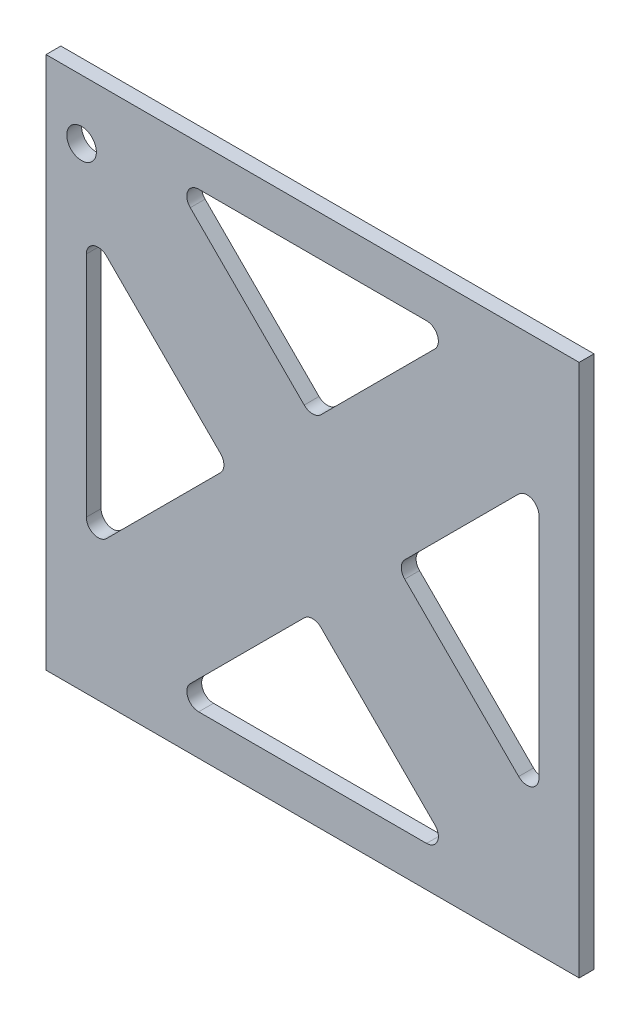
ISO-10303-21;
HEADER;
FILE_DESCRIPTION(('STEP AP214'),'2;1');
FILE_NAME('part.step','',(''),(''),'','','');
FILE_SCHEMA(('AUTOMOTIVE_DESIGN { 1 0 10303 214 1 1 1 1 }'));
ENDSEC;
DATA;
#1=APPLICATION_CONTEXT('core data for automotive mechanical design processes');
#2=APPLICATION_PROTOCOL_DEFINITION('international standard','automotive_design',2000,#1);
#3=PRODUCT_CONTEXT('',#1,'mechanical');
#4=PRODUCT('Part','Part','',(#3));
#5=PRODUCT_RELATED_PRODUCT_CATEGORY('part','',(#4));
#6=PRODUCT_DEFINITION_FORMATION('','',#4);
#7=PRODUCT_DEFINITION_CONTEXT('part definition',#1,'design');
#8=PRODUCT_DEFINITION('design','',#6,#7);
#9=PRODUCT_DEFINITION_SHAPE('','',#8);
#10=(LENGTH_UNIT() NAMED_UNIT(*) SI_UNIT(.MILLI.,.METRE.));
#11=(NAMED_UNIT(*) PLANE_ANGLE_UNIT() SI_UNIT($,.RADIAN.));
#12=(NAMED_UNIT(*) SI_UNIT($,.STERADIAN.) SOLID_ANGLE_UNIT());
#13=UNCERTAINTY_MEASURE_WITH_UNIT(LENGTH_MEASURE(1.E-05),#10,'distance_accuracy_value','');
#14=(GEOMETRIC_REPRESENTATION_CONTEXT(3) GLOBAL_UNCERTAINTY_ASSIGNED_CONTEXT((#13)) GLOBAL_UNIT_ASSIGNED_CONTEXT((#10,
#11,#12)) REPRESENTATION_CONTEXT('',''));
#15=CARTESIAN_POINT('',(0.,0.,0.));
#16=DIRECTION('',(0.,0.,1.));
#17=DIRECTION('',(1.,0.,0.));
#18=AXIS2_PLACEMENT_3D('',#15,#16,#17);
#19=CARTESIAN_POINT('',(0.,0.,1.5875));
#20=DIRECTION('',(0.,0.,-1.));
#21=DIRECTION('',(-1.,0.,0.));
#22=AXIS2_PLACEMENT_3D('',#19,#20,#21);
#23=PLANE('',#22);
#24=CARTESIAN_POINT('',(24.4251878529386,-45.9778025435045,1.5875));
#25=DIRECTION('',(0.,0.,1.));
#26=DIRECTION('',(1.,0.,0.));
#27=AXIS2_PLACEMENT_3D('',#24,#25,#26);
#28=CIRCLE('',#27,2.54);
#29=CARTESIAN_POINT('',(24.4251878529385,-48.5178025435045,1.5875));
#30=VERTEX_POINT('',#29);
#31=CARTESIAN_POINT('',(26.2212390771524,-44.1817513192906,1.5875));
#32=VERTEX_POINT('',#31);
#33=EDGE_CURVE('E274',#30,#32,#28,.T.);
#34=ORIENTED_EDGE('',*,*,#33,.F.);
#35=DIRECTION('',(1.,0.,0.));
#36=VECTOR('',#35,1.);
#37=CARTESIAN_POINT('',(-24.4251878529385,-48.5178025435045,1.5875));
#38=LINE('',#37,#36);
#39=CARTESIAN_POINT('',(-24.4251878529385,-48.5178025435045,1.5875));
#40=VERTEX_POINT('',#39);
#41=EDGE_CURVE('E286',#40,#30,#38,.T.);
#42=ORIENTED_EDGE('',*,*,#41,.F.);
#43=CARTESIAN_POINT('',(-24.4251878529386,-45.9778025435045,1.5875));
#44=DIRECTION('',(0.,0.,1.));
#45=DIRECTION('',(1.,0.,0.));
#46=AXIS2_PLACEMENT_3D('',#43,#44,#45);
#47=CIRCLE('',#46,2.54000000000002);
#48=CARTESIAN_POINT('',(-26.2212390771524,-44.1817513192907,1.5875));
#49=VERTEX_POINT('',#48);
#50=EDGE_CURVE('E283',#49,#40,#47,.T.);
#51=ORIENTED_EDGE('',*,*,#50,.F.);
#52=DIRECTION('',(-0.707106781186548,-0.707106781186547,0.));
#53=VECTOR('',#52,1.);
#54=CARTESIAN_POINT('',(-1.7960512242138,-19.7565634663521,1.5875));
#55=LINE('',#54,#53);
#56=CARTESIAN_POINT('',(-1.7960512242138,-19.7565634663521,1.5875));
#57=VERTEX_POINT('',#56);
#58=EDGE_CURVE('E281',#57,#49,#55,.T.);
#59=ORIENTED_EDGE('',*,*,#58,.F.);
#60=CARTESIAN_POINT('',(0.,-21.552614690566,1.5875));
#61=DIRECTION('',(0.,0.,1.));
#62=DIRECTION('',(-1.,0.,0.));
#63=AXIS2_PLACEMENT_3D('',#60,#61,#62);
#64=CIRCLE('',#63,2.54000000000003);
#65=CARTESIAN_POINT('',(1.79605122421386,-19.7565634663521,1.5875));
#66=VERTEX_POINT('',#65);
#67=EDGE_CURVE('E279',#66,#57,#64,.T.);
#68=ORIENTED_EDGE('',*,*,#67,.F.);
#69=DIRECTION('',(-0.707106781186547,0.707106781186548,0.));
#70=VECTOR('',#69,1.);
#71=CARTESIAN_POINT('',(1.79605122421386,-19.7565634663521,1.5875));
#72=LINE('',#71,#70);
#73=EDGE_CURVE('E276',#32,#66,#72,.T.);
#74=ORIENTED_EDGE('',*,*,#73,.F.);
#75=EDGE_LOOP('',(#34,#42,#51,#59,#68,#74));
#76=FACE_BOUND('',#75,.T.);
#77=CARTESIAN_POINT('',(-45.9778025435045,-24.4251878529386,1.5875));
#78=DIRECTION('',(0.,0.,1.));
#79=DIRECTION('',(1.,0.,0.));
#80=AXIS2_PLACEMENT_3D('',#77,#78,#79);
#81=CIRCLE('',#80,2.54000000000004);
#82=CARTESIAN_POINT('',(-48.5178025435045,-24.4251878529386,1.5875));
#83=VERTEX_POINT('',#82);
#84=CARTESIAN_POINT('',(-44.1817513192906,-26.2212390771524,1.5875));
#85=VERTEX_POINT('',#84);
#86=EDGE_CURVE('E364',#83,#85,#81,.T.);
#87=ORIENTED_EDGE('',*,*,#86,.F.);
#88=DIRECTION('',(0.,-1.,0.));
#89=VECTOR('',#88,1.);
#90=CARTESIAN_POINT('',(-48.5178025435045,24.4251878529386,1.5875));
#91=LINE('',#90,#89);
#92=CARTESIAN_POINT('',(-48.5178025435045,24.4251878529386,1.5875));
#93=VERTEX_POINT('',#92);
#94=EDGE_CURVE('E376',#93,#83,#91,.T.);
#95=ORIENTED_EDGE('',*,*,#94,.F.);
#96=CARTESIAN_POINT('',(-45.9778025435045,24.4251878529386,1.5875));
#97=DIRECTION('',(0.,0.,1.));
#98=DIRECTION('',(1.,0.,0.));
#99=AXIS2_PLACEMENT_3D('',#96,#97,#98);
#100=CIRCLE('',#99,2.54000000000004);
#101=CARTESIAN_POINT('',(-44.1817513192906,26.2212390771524,1.5875));
#102=VERTEX_POINT('',#101);
#103=EDGE_CURVE('E373',#102,#93,#100,.T.);
#104=ORIENTED_EDGE('',*,*,#103,.F.);
#105=DIRECTION('',(-0.707106781186547,0.707106781186548,0.));
#106=VECTOR('',#105,1.);
#107=CARTESIAN_POINT('',(-19.7565634663521,1.79605122421385,1.5875));
#108=LINE('',#107,#106);
#109=CARTESIAN_POINT('',(-19.7565634663521,1.79605122421385,1.5875));
#110=VERTEX_POINT('',#109);
#111=EDGE_CURVE('E371',#110,#102,#108,.T.);
#112=ORIENTED_EDGE('',*,*,#111,.F.);
#113=CARTESIAN_POINT('',(-21.5526146905659,0.,1.5875));
#114=DIRECTION('',(0.,0.,1.));
#115=DIRECTION('',(-1.,0.,0.));
#116=AXIS2_PLACEMENT_3D('',#113,#114,#115);
#117=CIRCLE('',#116,2.54000000000004);
#118=CARTESIAN_POINT('',(-19.7565634663521,-1.79605122421386,1.5875));
#119=VERTEX_POINT('',#118);
#120=EDGE_CURVE('E369',#119,#110,#117,.T.);
#121=ORIENTED_EDGE('',*,*,#120,.F.);
#122=DIRECTION('',(0.707106781186547,0.707106781186548,0.));
#123=VECTOR('',#122,1.);
#124=CARTESIAN_POINT('',(-19.7565634663521,-1.79605122421386,1.5875));
#125=LINE('',#124,#123);
#126=EDGE_CURVE('E366',#85,#119,#125,.T.);
#127=ORIENTED_EDGE('',*,*,#126,.F.);
#128=EDGE_LOOP('',(#87,#95,#104,#112,#121,#127));
#129=FACE_BOUND('',#128,.T.);
#130=DIRECTION('',(0.,-1.,0.));
#131=VECTOR('',#130,1.);
#132=CARTESIAN_POINT('',(-57.15,-57.15,1.5875));
#133=LINE('',#132,#131);
#134=CARTESIAN_POINT('',(-57.15,57.15,1.5875));
#135=VERTEX_POINT('',#134);
#136=CARTESIAN_POINT('',(-57.15,-57.15,1.5875));
#137=VERTEX_POINT('',#136);
#138=EDGE_CURVE('E415',#135,#137,#133,.T.);
#139=ORIENTED_EDGE('',*,*,#138,.T.);
#140=DIRECTION('',(1.,0.,0.));
#141=VECTOR('',#140,1.);
#142=CARTESIAN_POINT('',(-57.15,-57.15,1.5875));
#143=LINE('',#142,#141);
#144=CARTESIAN_POINT('',(57.15,-57.15,1.5875));
#145=VERTEX_POINT('',#144);
#146=EDGE_CURVE('E418',#137,#145,#143,.T.);
#147=ORIENTED_EDGE('',*,*,#146,.T.);
#148=DIRECTION('',(0.,1.,0.));
#149=VECTOR('',#148,1.);
#150=CARTESIAN_POINT('',(57.15,-57.15,1.5875));
#151=LINE('',#150,#149);
#152=CARTESIAN_POINT('',(57.15,57.15,1.5875));
#153=VERTEX_POINT('',#152);
#154=EDGE_CURVE('E421',#145,#153,#151,.T.);
#155=ORIENTED_EDGE('',*,*,#154,.T.);
#156=DIRECTION('',(-1.,0.,0.));
#157=VECTOR('',#156,1.);
#158=CARTESIAN_POINT('',(-57.15,57.15,1.5875));
#159=LINE('',#158,#157);
#160=EDGE_CURVE('E423',#153,#135,#159,.T.);
#161=ORIENTED_EDGE('',*,*,#160,.T.);
#162=EDGE_LOOP('',(#139,#147,#155,#161));
#163=FACE_BOUND('',#162,.T.);
#164=CARTESIAN_POINT('',(-49.53,44.45,1.5875));
#165=DIRECTION('',(0.,0.,1.));
#166=DIRECTION('',(1.,0.,0.));
#167=AXIS2_PLACEMENT_3D('',#164,#165,#166);
#168=CIRCLE('',#167,3.175);
#169=CARTESIAN_POINT('',(-46.355,44.45,1.5875));
#170=VERTEX_POINT('',#169);
#171=EDGE_CURVE('E409',#170,#170,#168,.T.);
#172=ORIENTED_EDGE('',*,*,#171,.F.);
#173=EDGE_LOOP('',(#172));
#174=FACE_BOUND('',#173,.T.);
#175=CARTESIAN_POINT('',(-24.4251878529386,45.9778025435045,1.5875));
#176=DIRECTION('',(0.,0.,1.));
#177=DIRECTION('',(1.,0.,0.));
#178=AXIS2_PLACEMENT_3D('',#175,#176,#177);
#179=CIRCLE('',#178,2.54000000000004);
#180=CARTESIAN_POINT('',(-24.4251878529386,48.5178025435045,1.5875));
#181=VERTEX_POINT('',#180);
#182=CARTESIAN_POINT('',(-26.2212390771525,44.1817513192906,1.5875));
#183=VERTEX_POINT('',#182);
#184=EDGE_CURVE('E319',#181,#183,#179,.T.);
#185=ORIENTED_EDGE('',*,*,#184,.F.);
#186=DIRECTION('',(-1.,0.,0.));
#187=VECTOR('',#186,1.);
#188=CARTESIAN_POINT('',(24.4251878529386,48.5178025435045,1.5875));
#189=LINE('',#188,#187);
#190=CARTESIAN_POINT('',(24.4251878529386,48.5178025435045,1.5875));
#191=VERTEX_POINT('',#190);
#192=EDGE_CURVE('E331',#191,#181,#189,.T.);
#193=ORIENTED_EDGE('',*,*,#192,.F.);
#194=CARTESIAN_POINT('',(24.4251878529386,45.9778025435045,1.5875));
#195=DIRECTION('',(0.,0.,1.));
#196=DIRECTION('',(1.,0.,0.));
#197=AXIS2_PLACEMENT_3D('',#194,#195,#196);
#198=CIRCLE('',#197,2.54000000000004);
#199=CARTESIAN_POINT('',(26.2212390771524,44.1817513192906,1.5875));
#200=VERTEX_POINT('',#199);
#201=EDGE_CURVE('E328',#200,#191,#198,.T.);
#202=ORIENTED_EDGE('',*,*,#201,.F.);
#203=DIRECTION('',(0.707106781186547,0.707106781186547,0.));
#204=VECTOR('',#203,1.);
#205=CARTESIAN_POINT('',(1.79605122421385,19.7565634663521,1.5875));
#206=LINE('',#205,#204);
#207=CARTESIAN_POINT('',(1.79605122421385,19.7565634663521,1.5875));
#208=VERTEX_POINT('',#207);
#209=EDGE_CURVE('E326',#208,#200,#206,.T.);
#210=ORIENTED_EDGE('',*,*,#209,.F.);
#211=CARTESIAN_POINT('',(0.,21.5526146905659,1.5875));
#212=DIRECTION('',(0.,0.,1.));
#213=DIRECTION('',(-1.,0.,0.));
#214=AXIS2_PLACEMENT_3D('',#211,#212,#213);
#215=CIRCLE('',#214,2.54000000000004);
#216=CARTESIAN_POINT('',(-1.79605122421386,19.7565634663521,1.5875));
#217=VERTEX_POINT('',#216);
#218=EDGE_CURVE('E324',#217,#208,#215,.T.);
#219=ORIENTED_EDGE('',*,*,#218,.F.);
#220=DIRECTION('',(0.707106781186547,-0.707106781186547,0.));
#221=VECTOR('',#220,1.);
#222=CARTESIAN_POINT('',(-1.79605122421386,19.7565634663521,1.5875));
#223=LINE('',#222,#221);
#224=EDGE_CURVE('E321',#183,#217,#223,.T.);
#225=ORIENTED_EDGE('',*,*,#224,.F.);
#226=EDGE_LOOP('',(#185,#193,#202,#210,#219,#225));
#227=FACE_BOUND('',#226,.T.);
#228=CARTESIAN_POINT('',(45.9778025435045,24.4251878529386,1.5875));
#229=DIRECTION('',(0.,0.,1.));
#230=DIRECTION('',(1.,0.,0.));
#231=AXIS2_PLACEMENT_3D('',#228,#229,#230);
#232=CIRCLE('',#231,2.54000000000004);
#233=CARTESIAN_POINT('',(48.5178025435045,24.4251878529386,1.5875));
#234=VERTEX_POINT('',#233);
#235=CARTESIAN_POINT('',(44.1817513192906,26.2212390771525,1.5875));
#236=VERTEX_POINT('',#235);
#237=EDGE_CURVE('E223',#234,#236,#232,.T.);
#238=ORIENTED_EDGE('',*,*,#237,.F.);
#239=DIRECTION('',(0.,1.,0.));
#240=VECTOR('',#239,1.);
#241=CARTESIAN_POINT('',(48.5178025435045,-24.4251878529386,1.5875));
#242=LINE('',#241,#240);
#243=CARTESIAN_POINT('',(48.5178025435045,-24.4251878529386,1.5875));
#244=VERTEX_POINT('',#243);
#245=EDGE_CURVE('E252',#244,#234,#242,.T.);
#246=ORIENTED_EDGE('',*,*,#245,.F.);
#247=CARTESIAN_POINT('',(45.9778025435045,-24.4251878529386,1.5875));
#248=DIRECTION('',(0.,0.,1.));
#249=DIRECTION('',(1.,0.,0.));
#250=AXIS2_PLACEMENT_3D('',#247,#248,#249);
#251=CIRCLE('',#250,2.54000000000003);
#252=CARTESIAN_POINT('',(44.1817513192906,-26.2212390771524,1.5875));
#253=VERTEX_POINT('',#252);
#254=EDGE_CURVE('E250',#253,#244,#251,.T.);
#255=ORIENTED_EDGE('',*,*,#254,.F.);
#256=DIRECTION('',(0.707106781186547,-0.707106781186547,0.));
#257=VECTOR('',#256,1.);
#258=CARTESIAN_POINT('',(19.7565634663521,-1.79605122421385,1.5875));
#259=LINE('',#258,#257);
#260=CARTESIAN_POINT('',(19.7565634663521,-1.79605122421385,1.5875));
#261=VERTEX_POINT('',#260);
#262=EDGE_CURVE('E246',#261,#253,#259,.T.);
#263=ORIENTED_EDGE('',*,*,#262,.F.);
#264=CARTESIAN_POINT('',(21.5526146905659,0.,1.5875));
#265=DIRECTION('',(0.,0.,1.));
#266=DIRECTION('',(-1.,0.,0.));
#267=AXIS2_PLACEMENT_3D('',#264,#265,#266);
#268=CIRCLE('',#267,2.54000000000004);
#269=CARTESIAN_POINT('',(19.7565634663521,1.79605122421386,1.5875));
#270=VERTEX_POINT('',#269);
#271=EDGE_CURVE('E244',#270,#261,#268,.T.);
#272=ORIENTED_EDGE('',*,*,#271,.F.);
#273=DIRECTION('',(-0.707106781186547,-0.707106781186548,0.));
#274=VECTOR('',#273,1.);
#275=CARTESIAN_POINT('',(19.7565634663521,1.79605122421386,1.5875));
#276=LINE('',#275,#274);
#277=EDGE_CURVE('E231',#236,#270,#276,.T.);
#278=ORIENTED_EDGE('',*,*,#277,.F.);
#279=EDGE_LOOP('',(#238,#246,#255,#263,#272,#278));
#280=FACE_BOUND('',#279,.T.);
#281=ADVANCED_FACE('F38',(#76,#129,#163,#174,#227,#280),#23,.F.);
#282=CARTESIAN_POINT('',(0.,0.,-1.5875));
#283=DIRECTION('',(0.,0.,-1.));
#284=DIRECTION('',(-1.,0.,0.));
#285=AXIS2_PLACEMENT_3D('',#282,#283,#284);
#286=PLANE('',#285);
#287=DIRECTION('',(0.,-1.,0.));
#288=VECTOR('',#287,1.);
#289=CARTESIAN_POINT('',(-57.15,-57.15,-1.5875));
#290=LINE('',#289,#288);
#291=CARTESIAN_POINT('',(-57.15,57.15,-1.5875));
#292=VERTEX_POINT('',#291);
#293=CARTESIAN_POINT('',(-57.15,-57.15,-1.5875));
#294=VERTEX_POINT('',#293);
#295=EDGE_CURVE('E412',#292,#294,#290,.T.);
#296=ORIENTED_EDGE('',*,*,#295,.F.);
#297=DIRECTION('',(-1.,0.,0.));
#298=VECTOR('',#297,1.);
#299=CARTESIAN_POINT('',(-57.15,57.15,-1.5875));
#300=LINE('',#299,#298);
#301=CARTESIAN_POINT('',(57.15,57.15,-1.5875));
#302=VERTEX_POINT('',#301);
#303=EDGE_CURVE('E419',#302,#292,#300,.T.);
#304=ORIENTED_EDGE('',*,*,#303,.F.);
#305=DIRECTION('',(0.,1.,0.));
#306=VECTOR('',#305,1.);
#307=CARTESIAN_POINT('',(57.15,-57.15,-1.5875));
#308=LINE('',#307,#306);
#309=CARTESIAN_POINT('',(57.15,-57.15,-1.5875));
#310=VERTEX_POINT('',#309);
#311=EDGE_CURVE('E430',#310,#302,#308,.T.);
#312=ORIENTED_EDGE('',*,*,#311,.F.);
#313=DIRECTION('',(1.,0.,0.));
#314=VECTOR('',#313,1.);
#315=CARTESIAN_POINT('',(-57.15,-57.15,-1.5875));
#316=LINE('',#315,#314);
#317=EDGE_CURVE('E428',#294,#310,#316,.T.);
#318=ORIENTED_EDGE('',*,*,#317,.F.);
#319=EDGE_LOOP('',(#296,#304,#312,#318));
#320=FACE_BOUND('',#319,.T.);
#321=CARTESIAN_POINT('',(-49.53,44.45,-1.5875));
#322=DIRECTION('',(0.,0.,1.));
#323=DIRECTION('',(1.,0.,0.));
#324=AXIS2_PLACEMENT_3D('',#321,#322,#323);
#325=CIRCLE('',#324,3.175);
#326=CARTESIAN_POINT('',(-46.355,44.45,-1.5875));
#327=VERTEX_POINT('',#326);
#328=EDGE_CURVE('E408',#327,#327,#325,.T.);
#329=ORIENTED_EDGE('',*,*,#328,.T.);
#330=EDGE_LOOP('',(#329));
#331=FACE_BOUND('',#330,.T.);
#332=DIRECTION('',(0.,-1.,0.));
#333=VECTOR('',#332,1.);
#334=CARTESIAN_POINT('',(-48.5178025435045,24.4251878529386,-1.5875));
#335=LINE('',#334,#333);
#336=CARTESIAN_POINT('',(-48.5178025435045,24.4251878529386,-1.5875));
#337=VERTEX_POINT('',#336);
#338=CARTESIAN_POINT('',(-48.5178025435045,-24.4251878529386,-1.5875));
#339=VERTEX_POINT('',#338);
#340=EDGE_CURVE('E367',#337,#339,#335,.T.);
#341=ORIENTED_EDGE('',*,*,#340,.T.);
#342=CARTESIAN_POINT('',(-45.9778025435045,-24.4251878529386,-1.5875));
#343=DIRECTION('',(0.,0.,1.));
#344=DIRECTION('',(1.,0.,0.));
#345=AXIS2_PLACEMENT_3D('',#342,#343,#344);
#346=CIRCLE('',#345,2.54000000000004);
#347=CARTESIAN_POINT('',(-44.1817513192906,-26.2212390771524,-1.5875));
#348=VERTEX_POINT('',#347);
#349=EDGE_CURVE('E363',#339,#348,#346,.T.);
#350=ORIENTED_EDGE('',*,*,#349,.T.);
#351=DIRECTION('',(0.707106781186547,0.707106781186548,0.));
#352=VECTOR('',#351,1.);
#353=CARTESIAN_POINT('',(-19.7565634663521,-1.79605122421386,-1.5875));
#354=LINE('',#353,#352);
#355=CARTESIAN_POINT('',(-19.7565634663521,-1.79605122421386,-1.5875));
#356=VERTEX_POINT('',#355);
#357=EDGE_CURVE('E381',#348,#356,#354,.T.);
#358=ORIENTED_EDGE('',*,*,#357,.T.);
#359=CARTESIAN_POINT('',(-21.5526146905659,0.,-1.5875));
#360=DIRECTION('',(0.,0.,1.));
#361=DIRECTION('',(-1.,0.,0.));
#362=AXIS2_PLACEMENT_3D('',#359,#360,#361);
#363=CIRCLE('',#362,2.54000000000004);
#364=CARTESIAN_POINT('',(-19.7565634663521,1.79605122421385,-1.5875));
#365=VERTEX_POINT('',#364);
#366=EDGE_CURVE('E384',#356,#365,#363,.T.);
#367=ORIENTED_EDGE('',*,*,#366,.T.);
#368=DIRECTION('',(-0.707106781186547,0.707106781186548,0.));
#369=VECTOR('',#368,1.);
#370=CARTESIAN_POINT('',(-19.7565634663521,1.79605122421385,-1.5875));
#371=LINE('',#370,#369);
#372=CARTESIAN_POINT('',(-44.1817513192906,26.2212390771524,-1.5875));
#373=VERTEX_POINT('',#372);
#374=EDGE_CURVE('E387',#365,#373,#371,.T.);
#375=ORIENTED_EDGE('',*,*,#374,.T.);
#376=CARTESIAN_POINT('',(-45.9778025435045,24.4251878529386,-1.5875));
#377=DIRECTION('',(0.,0.,1.));
#378=DIRECTION('',(1.,0.,0.));
#379=AXIS2_PLACEMENT_3D('',#376,#377,#378);
#380=CIRCLE('',#379,2.54000000000004);
#381=EDGE_CURVE('E390',#373,#337,#380,.T.);
#382=ORIENTED_EDGE('',*,*,#381,.T.);
#383=EDGE_LOOP('',(#341,#350,#358,#367,#375,#382));
#384=FACE_BOUND('',#383,.T.);
#385=DIRECTION('',(-1.,0.,0.));
#386=VECTOR('',#385,1.);
#387=CARTESIAN_POINT('',(24.4251878529386,48.5178025435045,-1.5875));
#388=LINE('',#387,#386);
#389=CARTESIAN_POINT('',(24.4251878529386,48.5178025435045,-1.5875));
#390=VERTEX_POINT('',#389);
#391=CARTESIAN_POINT('',(-24.4251878529386,48.5178025435045,-1.5875));
#392=VERTEX_POINT('',#391);
#393=EDGE_CURVE('E322',#390,#392,#388,.T.);
#394=ORIENTED_EDGE('',*,*,#393,.T.);
#395=CARTESIAN_POINT('',(-24.4251878529386,45.9778025435045,-1.5875));
#396=DIRECTION('',(0.,0.,1.));
#397=DIRECTION('',(1.,0.,0.));
#398=AXIS2_PLACEMENT_3D('',#395,#396,#397);
#399=CIRCLE('',#398,2.54000000000004);
#400=CARTESIAN_POINT('',(-26.2212390771525,44.1817513192906,-1.5875));
#401=VERTEX_POINT('',#400);
#402=EDGE_CURVE('E318',#392,#401,#399,.T.);
#403=ORIENTED_EDGE('',*,*,#402,.T.);
#404=DIRECTION('',(0.707106781186547,-0.707106781186547,0.));
#405=VECTOR('',#404,1.);
#406=CARTESIAN_POINT('',(-1.79605122421386,19.7565634663521,-1.5875));
#407=LINE('',#406,#405);
#408=CARTESIAN_POINT('',(-1.79605122421386,19.7565634663521,-1.5875));
#409=VERTEX_POINT('',#408);
#410=EDGE_CURVE('E336',#401,#409,#407,.T.);
#411=ORIENTED_EDGE('',*,*,#410,.T.);
#412=CARTESIAN_POINT('',(0.,21.5526146905659,-1.5875));
#413=DIRECTION('',(0.,0.,1.));
#414=DIRECTION('',(-1.,0.,0.));
#415=AXIS2_PLACEMENT_3D('',#412,#413,#414);
#416=CIRCLE('',#415,2.54000000000004);
#417=CARTESIAN_POINT('',(1.79605122421385,19.7565634663521,-1.5875));
#418=VERTEX_POINT('',#417);
#419=EDGE_CURVE('E339',#409,#418,#416,.T.);
#420=ORIENTED_EDGE('',*,*,#419,.T.);
#421=DIRECTION('',(0.707106781186547,0.707106781186547,0.));
#422=VECTOR('',#421,1.);
#423=CARTESIAN_POINT('',(1.79605122421385,19.7565634663521,-1.5875));
#424=LINE('',#423,#422);
#425=CARTESIAN_POINT('',(26.2212390771524,44.1817513192906,-1.5875));
#426=VERTEX_POINT('',#425);
#427=EDGE_CURVE('E342',#418,#426,#424,.T.);
#428=ORIENTED_EDGE('',*,*,#427,.T.);
#429=CARTESIAN_POINT('',(24.4251878529386,45.9778025435045,-1.5875));
#430=DIRECTION('',(0.,0.,1.));
#431=DIRECTION('',(1.,0.,0.));
#432=AXIS2_PLACEMENT_3D('',#429,#430,#431);
#433=CIRCLE('',#432,2.54000000000004);
#434=EDGE_CURVE('E345',#426,#390,#433,.T.);
#435=ORIENTED_EDGE('',*,*,#434,.T.);
#436=EDGE_LOOP('',(#394,#403,#411,#420,#428,#435));
#437=FACE_BOUND('',#436,.T.);
#438=DIRECTION('',(1.,0.,0.));
#439=VECTOR('',#438,1.);
#440=CARTESIAN_POINT('',(-24.4251878529385,-48.5178025435045,-1.5875));
#441=LINE('',#440,#439);
#442=CARTESIAN_POINT('',(-24.4251878529385,-48.5178025435045,-1.5875));
#443=VERTEX_POINT('',#442);
#444=CARTESIAN_POINT('',(24.4251878529385,-48.5178025435045,-1.5875));
#445=VERTEX_POINT('',#444);
#446=EDGE_CURVE('E277',#443,#445,#441,.T.);
#447=ORIENTED_EDGE('',*,*,#446,.T.);
#448=CARTESIAN_POINT('',(24.4251878529386,-45.9778025435045,-1.5875));
#449=DIRECTION('',(0.,0.,1.));
#450=DIRECTION('',(1.,0.,0.));
#451=AXIS2_PLACEMENT_3D('',#448,#449,#450);
#452=CIRCLE('',#451,2.54);
#453=CARTESIAN_POINT('',(26.2212390771524,-44.1817513192906,-1.5875));
#454=VERTEX_POINT('',#453);
#455=EDGE_CURVE('E239',#445,#454,#452,.T.);
#456=ORIENTED_EDGE('',*,*,#455,.T.);
#457=DIRECTION('',(-0.707106781186547,0.707106781186548,0.));
#458=VECTOR('',#457,1.);
#459=CARTESIAN_POINT('',(1.79605122421386,-19.7565634663521,-1.5875));
#460=LINE('',#459,#458);
#461=CARTESIAN_POINT('',(1.79605122421386,-19.7565634663521,-1.5875));
#462=VERTEX_POINT('',#461);
#463=EDGE_CURVE('E291',#454,#462,#460,.T.);
#464=ORIENTED_EDGE('',*,*,#463,.T.);
#465=CARTESIAN_POINT('',(0.,-21.552614690566,-1.5875));
#466=DIRECTION('',(0.,0.,1.));
#467=DIRECTION('',(-1.,0.,0.));
#468=AXIS2_PLACEMENT_3D('',#465,#466,#467);
#469=CIRCLE('',#468,2.54000000000003);
#470=CARTESIAN_POINT('',(-1.7960512242138,-19.7565634663521,-1.5875));
#471=VERTEX_POINT('',#470);
#472=EDGE_CURVE('E294',#462,#471,#469,.T.);
#473=ORIENTED_EDGE('',*,*,#472,.T.);
#474=DIRECTION('',(-0.707106781186548,-0.707106781186547,0.));
#475=VECTOR('',#474,1.);
#476=CARTESIAN_POINT('',(-1.7960512242138,-19.7565634663521,-1.5875));
#477=LINE('',#476,#475);
#478=CARTESIAN_POINT('',(-26.2212390771524,-44.1817513192907,-1.5875));
#479=VERTEX_POINT('',#478);
#480=EDGE_CURVE('E297',#471,#479,#477,.T.);
#481=ORIENTED_EDGE('',*,*,#480,.T.);
#482=CARTESIAN_POINT('',(-24.4251878529386,-45.9778025435045,-1.5875));
#483=DIRECTION('',(0.,0.,1.));
#484=DIRECTION('',(1.,0.,0.));
#485=AXIS2_PLACEMENT_3D('',#482,#483,#484);
#486=CIRCLE('',#485,2.54000000000002);
#487=EDGE_CURVE('E300',#479,#443,#486,.T.);
#488=ORIENTED_EDGE('',*,*,#487,.T.);
#489=EDGE_LOOP('',(#447,#456,#464,#473,#481,#488));
#490=FACE_BOUND('',#489,.T.);
#491=DIRECTION('',(0.,1.,0.));
#492=VECTOR('',#491,1.);
#493=CARTESIAN_POINT('',(48.5178025435045,-24.4251878529386,-1.5875));
#494=LINE('',#493,#492);
#495=CARTESIAN_POINT('',(48.5178025435045,-24.4251878529386,-1.5875));
#496=VERTEX_POINT('',#495);
#497=CARTESIAN_POINT('',(48.5178025435045,24.4251878529386,-1.5875));
#498=VERTEX_POINT('',#497);
#499=EDGE_CURVE('E232',#496,#498,#494,.T.);
#500=ORIENTED_EDGE('',*,*,#499,.T.);
#501=CARTESIAN_POINT('',(45.9778025435045,24.4251878529386,-1.5875));
#502=DIRECTION('',(0.,0.,1.));
#503=DIRECTION('',(1.,0.,0.));
#504=AXIS2_PLACEMENT_3D('',#501,#502,#503);
#505=CIRCLE('',#504,2.54000000000004);
#506=CARTESIAN_POINT('',(44.1817513192906,26.2212390771525,-1.5875));
#507=VERTEX_POINT('',#506);
#508=EDGE_CURVE('E61',#498,#507,#505,.T.);
#509=ORIENTED_EDGE('',*,*,#508,.T.);
#510=DIRECTION('',(-0.707106781186547,-0.707106781186548,0.));
#511=VECTOR('',#510,1.);
#512=CARTESIAN_POINT('',(19.7565634663521,1.79605122421386,-1.5875));
#513=LINE('',#512,#511);
#514=CARTESIAN_POINT('',(19.7565634663521,1.79605122421386,-1.5875));
#515=VERTEX_POINT('',#514);
#516=EDGE_CURVE('E238',#507,#515,#513,.T.);
#517=ORIENTED_EDGE('',*,*,#516,.T.);
#518=CARTESIAN_POINT('',(21.5526146905659,0.,-1.5875));
#519=DIRECTION('',(0.,0.,1.));
#520=DIRECTION('',(-1.,0.,0.));
#521=AXIS2_PLACEMENT_3D('',#518,#519,#520);
#522=CIRCLE('',#521,2.54000000000004);
#523=CARTESIAN_POINT('',(19.7565634663521,-1.79605122421385,-1.5875));
#524=VERTEX_POINT('',#523);
#525=EDGE_CURVE('E256',#515,#524,#522,.T.);
#526=ORIENTED_EDGE('',*,*,#525,.T.);
#527=DIRECTION('',(0.707106781186547,-0.707106781186547,0.));
#528=VECTOR('',#527,1.);
#529=CARTESIAN_POINT('',(19.7565634663521,-1.79605122421385,-1.5875));
#530=LINE('',#529,#528);
#531=CARTESIAN_POINT('',(44.1817513192906,-26.2212390771524,-1.5875));
#532=VERTEX_POINT('',#531);
#533=EDGE_CURVE('E259',#524,#532,#530,.T.);
#534=ORIENTED_EDGE('',*,*,#533,.T.);
#535=CARTESIAN_POINT('',(45.9778025435045,-24.4251878529386,-1.5875));
#536=DIRECTION('',(0.,0.,1.));
#537=DIRECTION('',(1.,0.,0.));
#538=AXIS2_PLACEMENT_3D('',#535,#536,#537);
#539=CIRCLE('',#538,2.54000000000003);
#540=EDGE_CURVE('E262',#532,#496,#539,.T.);
#541=ORIENTED_EDGE('',*,*,#540,.T.);
#542=EDGE_LOOP('',(#500,#509,#517,#526,#534,#541));
#543=FACE_BOUND('',#542,.T.);
#544=ADVANCED_FACE('F448',(#320,#331,#384,#437,#490,#543),#286,.T.);
#545=CARTESIAN_POINT('',(-57.15,-57.15,1.5875));
#546=DIRECTION('',(1.,0.,0.));
#547=DIRECTION('',(0.,0.,-1.));
#548=AXIS2_PLACEMENT_3D('',#545,#546,#547);
#549=PLANE('',#548);
#550=ORIENTED_EDGE('',*,*,#295,.T.);
#551=DIRECTION('',(0.,0.,-1.));
#552=VECTOR('',#551,1.);
#553=CARTESIAN_POINT('',(-57.15,-57.15,1.5875));
#554=LINE('',#553,#552);
#555=EDGE_CURVE('E11',#137,#294,#554,.T.);
#556=ORIENTED_EDGE('',*,*,#555,.F.);
#557=ORIENTED_EDGE('',*,*,#138,.F.);
#558=DIRECTION('',(0.,0.,-1.));
#559=VECTOR('',#558,1.);
#560=CARTESIAN_POINT('',(-57.15,57.15,1.5875));
#561=LINE('',#560,#559);
#562=EDGE_CURVE('E425',#135,#292,#561,.T.);
#563=ORIENTED_EDGE('',*,*,#562,.T.);
#564=EDGE_LOOP('',(#550,#556,#557,#563));
#565=FACE_BOUND('',#564,.T.);
#566=ADVANCED_FACE('F40',(#565),#549,.F.);
#567=CARTESIAN_POINT('',(-57.15,-57.15,1.5875));
#568=DIRECTION('',(0.,1.,0.));
#569=DIRECTION('',(0.,0.,1.));
#570=AXIS2_PLACEMENT_3D('',#567,#568,#569);
#571=PLANE('',#570);
#572=ORIENTED_EDGE('',*,*,#317,.T.);
#573=DIRECTION('',(0.,0.,-1.));
#574=VECTOR('',#573,1.);
#575=CARTESIAN_POINT('',(57.15,-57.15,1.5875));
#576=LINE('',#575,#574);
#577=EDGE_CURVE('E46',#145,#310,#576,.T.);
#578=ORIENTED_EDGE('',*,*,#577,.F.);
#579=ORIENTED_EDGE('',*,*,#146,.F.);
#580=ORIENTED_EDGE('',*,*,#555,.T.);
#581=EDGE_LOOP('',(#572,#578,#579,#580));
#582=FACE_BOUND('',#581,.T.);
#583=ADVANCED_FACE('F459',(#582),#571,.F.);
#584=CARTESIAN_POINT('',(57.15,-57.15,1.5875));
#585=DIRECTION('',(-1.,0.,0.));
#586=DIRECTION('',(0.,0.,1.));
#587=AXIS2_PLACEMENT_3D('',#584,#585,#586);
#588=PLANE('',#587);
#589=ORIENTED_EDGE('',*,*,#311,.T.);
#590=DIRECTION('',(0.,0.,-1.));
#591=VECTOR('',#590,1.);
#592=CARTESIAN_POINT('',(57.15,57.15,1.5875));
#593=LINE('',#592,#591);
#594=EDGE_CURVE('E435',#153,#302,#593,.T.);
#595=ORIENTED_EDGE('',*,*,#594,.F.);
#596=ORIENTED_EDGE('',*,*,#154,.F.);
#597=ORIENTED_EDGE('',*,*,#577,.T.);
#598=EDGE_LOOP('',(#589,#595,#596,#597));
#599=FACE_BOUND('',#598,.T.);
#600=ADVANCED_FACE('F442',(#599),#588,.F.);
#601=CARTESIAN_POINT('',(-57.15,57.15,1.5875));
#602=DIRECTION('',(0.,-1.,0.));
#603=DIRECTION('',(0.,0.,-1.));
#604=AXIS2_PLACEMENT_3D('',#601,#602,#603);
#605=PLANE('',#604);
#606=ORIENTED_EDGE('',*,*,#303,.T.);
#607=ORIENTED_EDGE('',*,*,#562,.F.);
#608=ORIENTED_EDGE('',*,*,#160,.F.);
#609=ORIENTED_EDGE('',*,*,#594,.T.);
#610=EDGE_LOOP('',(#606,#607,#608,#609));
#611=FACE_BOUND('',#610,.T.);
#612=ADVANCED_FACE('F452',(#611),#605,.F.);
#613=CARTESIAN_POINT('',(-49.53,44.45,1.5875));
#614=DIRECTION('',(0.,0.,-1.));
#615=DIRECTION('',(-1.,0.,0.));
#616=AXIS2_PLACEMENT_3D('',#613,#614,#615);
#617=CYLINDRICAL_SURFACE('',#616,3.175);
#618=ORIENTED_EDGE('',*,*,#171,.T.);
#619=EDGE_LOOP('',(#618));
#620=FACE_BOUND('',#619,.T.);
#621=ORIENTED_EDGE('',*,*,#328,.F.);
#622=EDGE_LOOP('',(#621));
#623=FACE_BOUND('',#622,.T.);
#624=ADVANCED_FACE('F476',(#620,#623),#617,.F.);
#625=CARTESIAN_POINT('',(-45.9778025435045,-24.4251878529386,1.5875));
#626=DIRECTION('',(0.,0.,-1.));
#627=DIRECTION('',(-1.,0.,0.));
#628=AXIS2_PLACEMENT_3D('',#625,#626,#627);
#629=CYLINDRICAL_SURFACE('',#628,2.54000000000004);
#630=ORIENTED_EDGE('',*,*,#349,.F.);
#631=DIRECTION('',(0.,0.,-1.));
#632=VECTOR('',#631,1.);
#633=CARTESIAN_POINT('',(-48.5178025435045,-24.4251878529386,1.5875));
#634=LINE('',#633,#632);
#635=EDGE_CURVE('E378',#83,#339,#634,.T.);
#636=ORIENTED_EDGE('',*,*,#635,.F.);
#637=ORIENTED_EDGE('',*,*,#86,.T.);
#638=DIRECTION('',(0.,0.,-1.));
#639=VECTOR('',#638,1.);
#640=CARTESIAN_POINT('',(-44.1817513192906,-26.2212390771524,1.5875));
#641=LINE('',#640,#639);
#642=EDGE_CURVE('E405',#85,#348,#641,.T.);
#643=ORIENTED_EDGE('',*,*,#642,.T.);
#644=EDGE_LOOP('',(#630,#636,#637,#643));
#645=FACE_BOUND('',#644,.T.);
#646=ADVANCED_FACE('F483',(#645),#629,.F.);
#647=CARTESIAN_POINT('',(-19.7565634663521,-1.79605122421386,1.5875));
#648=DIRECTION('',(-0.707106781186548,0.707106781186547,0.));
#649=DIRECTION('',(-0.707106781186547,-0.707106781186548,0.));
#650=AXIS2_PLACEMENT_3D('',#647,#648,#649);
#651=PLANE('',#650);
#652=ORIENTED_EDGE('',*,*,#357,.F.);
#653=ORIENTED_EDGE('',*,*,#642,.F.);
#654=ORIENTED_EDGE('',*,*,#126,.T.);
#655=DIRECTION('',(0.,0.,-1.));
#656=VECTOR('',#655,1.);
#657=CARTESIAN_POINT('',(-19.7565634663521,-1.79605122421386,1.5875));
#658=LINE('',#657,#656);
#659=EDGE_CURVE('E403',#119,#356,#658,.T.);
#660=ORIENTED_EDGE('',*,*,#659,.T.);
#661=EDGE_LOOP('',(#652,#653,#654,#660));
#662=FACE_BOUND('',#661,.T.);
#663=ADVANCED_FACE('F488',(#662),#651,.T.);
#664=CARTESIAN_POINT('',(-21.5526146905659,0.,1.5875));
#665=DIRECTION('',(0.,0.,-1.));
#666=DIRECTION('',(-1.,0.,0.));
#667=AXIS2_PLACEMENT_3D('',#664,#665,#666);
#668=CYLINDRICAL_SURFACE('',#667,2.54000000000004);
#669=ORIENTED_EDGE('',*,*,#366,.F.);
#670=ORIENTED_EDGE('',*,*,#659,.F.);
#671=ORIENTED_EDGE('',*,*,#120,.T.);
#672=DIRECTION('',(0.,0.,-1.));
#673=VECTOR('',#672,1.);
#674=CARTESIAN_POINT('',(-19.7565634663521,1.79605122421385,1.5875));
#675=LINE('',#674,#673);
#676=EDGE_CURVE('E401',#110,#365,#675,.T.);
#677=ORIENTED_EDGE('',*,*,#676,.T.);
#678=EDGE_LOOP('',(#669,#670,#671,#677));
#679=FACE_BOUND('',#678,.T.);
#680=ADVANCED_FACE('F584',(#679),#668,.F.);
#681=CARTESIAN_POINT('',(-19.7565634663521,1.79605122421385,1.5875));
#682=DIRECTION('',(-0.707106781186548,-0.707106781186547,0.));
#683=DIRECTION('',(0.707106781186547,-0.707106781186548,0.));
#684=AXIS2_PLACEMENT_3D('',#681,#682,#683);
#685=PLANE('',#684);
#686=ORIENTED_EDGE('',*,*,#374,.F.);
#687=ORIENTED_EDGE('',*,*,#676,.F.);
#688=ORIENTED_EDGE('',*,*,#111,.T.);
#689=DIRECTION('',(0.,0.,-1.));
#690=VECTOR('',#689,1.);
#691=CARTESIAN_POINT('',(-44.1817513192906,26.2212390771524,1.5875));
#692=LINE('',#691,#690);
#693=EDGE_CURVE('E399',#102,#373,#692,.T.);
#694=ORIENTED_EDGE('',*,*,#693,.T.);
#695=EDGE_LOOP('',(#686,#687,#688,#694));
#696=FACE_BOUND('',#695,.T.);
#697=ADVANCED_FACE('F580',(#696),#685,.T.);
#698=CARTESIAN_POINT('',(-45.9778025435045,24.4251878529386,1.5875));
#699=DIRECTION('',(0.,0.,-1.));
#700=DIRECTION('',(-1.,0.,0.));
#701=AXIS2_PLACEMENT_3D('',#698,#699,#700);
#702=CYLINDRICAL_SURFACE('',#701,2.54000000000004);
#703=ORIENTED_EDGE('',*,*,#381,.F.);
#704=ORIENTED_EDGE('',*,*,#693,.F.);
#705=ORIENTED_EDGE('',*,*,#103,.T.);
#706=DIRECTION('',(0.,0.,-1.));
#707=VECTOR('',#706,1.);
#708=CARTESIAN_POINT('',(-48.5178025435045,24.4251878529386,1.5875));
#709=LINE('',#708,#707);
#710=EDGE_CURVE('E397',#93,#337,#709,.T.);
#711=ORIENTED_EDGE('',*,*,#710,.T.);
#712=EDGE_LOOP('',(#703,#704,#705,#711));
#713=FACE_BOUND('',#712,.T.);
#714=ADVANCED_FACE('F576',(#713),#702,.F.);
#715=CARTESIAN_POINT('',(-48.5178025435045,24.4251878529386,1.5875));
#716=DIRECTION('',(1.,0.,0.));
#717=DIRECTION('',(0.,0.,-1.));
#718=AXIS2_PLACEMENT_3D('',#715,#716,#717);
#719=PLANE('',#718);
#720=ORIENTED_EDGE('',*,*,#340,.F.);
#721=ORIENTED_EDGE('',*,*,#710,.F.);
#722=ORIENTED_EDGE('',*,*,#94,.T.);
#723=ORIENTED_EDGE('',*,*,#635,.T.);
#724=EDGE_LOOP('',(#720,#721,#722,#723));
#725=FACE_BOUND('',#724,.T.);
#726=ADVANCED_FACE('F572',(#725),#719,.T.);
#727=CARTESIAN_POINT('',(-24.4251878529386,45.9778025435045,1.5875));
#728=DIRECTION('',(0.,0.,-1.));
#729=DIRECTION('',(-1.,0.,0.));
#730=AXIS2_PLACEMENT_3D('',#727,#728,#729);
#731=CYLINDRICAL_SURFACE('',#730,2.54000000000004);
#732=ORIENTED_EDGE('',*,*,#402,.F.);
#733=DIRECTION('',(0.,0.,-1.));
#734=VECTOR('',#733,1.);
#735=CARTESIAN_POINT('',(-24.4251878529386,48.5178025435045,1.5875));
#736=LINE('',#735,#734);
#737=EDGE_CURVE('E333',#181,#392,#736,.T.);
#738=ORIENTED_EDGE('',*,*,#737,.F.);
#739=ORIENTED_EDGE('',*,*,#184,.T.);
#740=DIRECTION('',(0.,0.,-1.));
#741=VECTOR('',#740,1.);
#742=CARTESIAN_POINT('',(-26.2212390771525,44.1817513192906,1.5875));
#743=LINE('',#742,#741);
#744=EDGE_CURVE('E360',#183,#401,#743,.T.);
#745=ORIENTED_EDGE('',*,*,#744,.T.);
#746=EDGE_LOOP('',(#732,#738,#739,#745));
#747=FACE_BOUND('',#746,.T.);
#748=ADVANCED_FACE('F568',(#747),#731,.F.);
#749=CARTESIAN_POINT('',(-1.79605122421386,19.7565634663521,1.5875));
#750=DIRECTION('',(0.707106781186548,0.707106781186548,0.));
#751=DIRECTION('',(-0.707106781186548,0.707106781186547,0.));
#752=AXIS2_PLACEMENT_3D('',#749,#750,#751);
#753=PLANE('',#752);
#754=ORIENTED_EDGE('',*,*,#410,.F.);
#755=ORIENTED_EDGE('',*,*,#744,.F.);
#756=ORIENTED_EDGE('',*,*,#224,.T.);
#757=DIRECTION('',(0.,0.,-1.));
#758=VECTOR('',#757,1.);
#759=CARTESIAN_POINT('',(-1.79605122421386,19.7565634663521,1.5875));
#760=LINE('',#759,#758);
#761=EDGE_CURVE('E358',#217,#409,#760,.T.);
#762=ORIENTED_EDGE('',*,*,#761,.T.);
#763=EDGE_LOOP('',(#754,#755,#756,#762));
#764=FACE_BOUND('',#763,.T.);
#765=ADVANCED_FACE('F564',(#764),#753,.T.);
#766=CARTESIAN_POINT('',(0.,21.5526146905659,1.5875));
#767=DIRECTION('',(0.,0.,-1.));
#768=DIRECTION('',(-1.,0.,0.));
#769=AXIS2_PLACEMENT_3D('',#766,#767,#768);
#770=CYLINDRICAL_SURFACE('',#769,2.54000000000004);
#771=ORIENTED_EDGE('',*,*,#419,.F.);
#772=ORIENTED_EDGE('',*,*,#761,.F.);
#773=ORIENTED_EDGE('',*,*,#218,.T.);
#774=DIRECTION('',(0.,0.,-1.));
#775=VECTOR('',#774,1.);
#776=CARTESIAN_POINT('',(1.79605122421385,19.7565634663521,1.5875));
#777=LINE('',#776,#775);
#778=EDGE_CURVE('E356',#208,#418,#777,.T.);
#779=ORIENTED_EDGE('',*,*,#778,.T.);
#780=EDGE_LOOP('',(#771,#772,#773,#779));
#781=FACE_BOUND('',#780,.T.);
#782=ADVANCED_FACE('F560',(#781),#770,.F.);
#783=CARTESIAN_POINT('',(1.79605122421385,19.7565634663521,1.5875));
#784=DIRECTION('',(-0.707106781186548,0.707106781186548,0.));
#785=DIRECTION('',(-0.707106781186548,-0.707106781186548,0.));
#786=AXIS2_PLACEMENT_3D('',#783,#784,#785);
#787=PLANE('',#786);
#788=ORIENTED_EDGE('',*,*,#427,.F.);
#789=ORIENTED_EDGE('',*,*,#778,.F.);
#790=ORIENTED_EDGE('',*,*,#209,.T.);
#791=DIRECTION('',(0.,0.,-1.));
#792=VECTOR('',#791,1.);
#793=CARTESIAN_POINT('',(26.2212390771524,44.1817513192906,1.5875));
#794=LINE('',#793,#792);
#795=EDGE_CURVE('E354',#200,#426,#794,.T.);
#796=ORIENTED_EDGE('',*,*,#795,.T.);
#797=EDGE_LOOP('',(#788,#789,#790,#796));
#798=FACE_BOUND('',#797,.T.);
#799=ADVANCED_FACE('F556',(#798),#787,.T.);
#800=CARTESIAN_POINT('',(24.4251878529386,45.9778025435045,1.5875));
#801=DIRECTION('',(0.,0.,-1.));
#802=DIRECTION('',(-1.,0.,0.));
#803=AXIS2_PLACEMENT_3D('',#800,#801,#802);
#804=CYLINDRICAL_SURFACE('',#803,2.54000000000004);
#805=ORIENTED_EDGE('',*,*,#434,.F.);
#806=ORIENTED_EDGE('',*,*,#795,.F.);
#807=ORIENTED_EDGE('',*,*,#201,.T.);
#808=DIRECTION('',(0.,0.,-1.));
#809=VECTOR('',#808,1.);
#810=CARTESIAN_POINT('',(24.4251878529386,48.5178025435045,1.5875));
#811=LINE('',#810,#809);
#812=EDGE_CURVE('E352',#191,#390,#811,.T.);
#813=ORIENTED_EDGE('',*,*,#812,.T.);
#814=EDGE_LOOP('',(#805,#806,#807,#813));
#815=FACE_BOUND('',#814,.T.);
#816=ADVANCED_FACE('F552',(#815),#804,.F.);
#817=CARTESIAN_POINT('',(24.4251878529386,48.5178025435045,1.5875));
#818=DIRECTION('',(0.,-1.,0.));
#819=DIRECTION('',(0.,0.,-1.));
#820=AXIS2_PLACEMENT_3D('',#817,#818,#819);
#821=PLANE('',#820);
#822=ORIENTED_EDGE('',*,*,#393,.F.);
#823=ORIENTED_EDGE('',*,*,#812,.F.);
#824=ORIENTED_EDGE('',*,*,#192,.T.);
#825=ORIENTED_EDGE('',*,*,#737,.T.);
#826=EDGE_LOOP('',(#822,#823,#824,#825));
#827=FACE_BOUND('',#826,.T.);
#828=ADVANCED_FACE('F548',(#827),#821,.T.);
#829=CARTESIAN_POINT('',(24.4251878529386,-45.9778025435045,1.5875));
#830=DIRECTION('',(0.,0.,-1.));
#831=DIRECTION('',(-1.,0.,0.));
#832=AXIS2_PLACEMENT_3D('',#829,#830,#831);
#833=CYLINDRICAL_SURFACE('',#832,2.54);
#834=ORIENTED_EDGE('',*,*,#455,.F.);
#835=DIRECTION('',(0.,0.,-1.));
#836=VECTOR('',#835,1.);
#837=CARTESIAN_POINT('',(24.4251878529385,-48.5178025435045,1.5875));
#838=LINE('',#837,#836);
#839=EDGE_CURVE('E288',#30,#445,#838,.T.);
#840=ORIENTED_EDGE('',*,*,#839,.F.);
#841=ORIENTED_EDGE('',*,*,#33,.T.);
#842=DIRECTION('',(0.,0.,-1.));
#843=VECTOR('',#842,1.);
#844=CARTESIAN_POINT('',(26.2212390771524,-44.1817513192906,1.5875));
#845=LINE('',#844,#843);
#846=EDGE_CURVE('E315',#32,#454,#845,.T.);
#847=ORIENTED_EDGE('',*,*,#846,.T.);
#848=EDGE_LOOP('',(#834,#840,#841,#847));
#849=FACE_BOUND('',#848,.T.);
#850=ADVANCED_FACE('F544',(#849),#833,.F.);
#851=CARTESIAN_POINT('',(1.79605122421386,-19.7565634663521,1.5875));
#852=DIRECTION('',(-0.707106781186548,-0.707106781186547,0.));
#853=DIRECTION('',(0.707106781186547,-0.707106781186548,0.));
#854=AXIS2_PLACEMENT_3D('',#851,#852,#853);
#855=PLANE('',#854);
#856=ORIENTED_EDGE('',*,*,#463,.F.);
#857=ORIENTED_EDGE('',*,*,#846,.F.);
#858=ORIENTED_EDGE('',*,*,#73,.T.);
#859=DIRECTION('',(0.,0.,-1.));
#860=VECTOR('',#859,1.);
#861=CARTESIAN_POINT('',(1.79605122421386,-19.7565634663521,1.5875));
#862=LINE('',#861,#860);
#863=EDGE_CURVE('E313',#66,#462,#862,.T.);
#864=ORIENTED_EDGE('',*,*,#863,.T.);
#865=EDGE_LOOP('',(#856,#857,#858,#864));
#866=FACE_BOUND('',#865,.T.);
#867=ADVANCED_FACE('F540',(#866),#855,.T.);
#868=CARTESIAN_POINT('',(0.,-21.552614690566,1.5875));
#869=DIRECTION('',(0.,0.,-1.));
#870=DIRECTION('',(-1.,0.,0.));
#871=AXIS2_PLACEMENT_3D('',#868,#869,#870);
#872=CYLINDRICAL_SURFACE('',#871,2.54000000000003);
#873=ORIENTED_EDGE('',*,*,#472,.F.);
#874=ORIENTED_EDGE('',*,*,#863,.F.);
#875=ORIENTED_EDGE('',*,*,#67,.T.);
#876=DIRECTION('',(0.,0.,-1.));
#877=VECTOR('',#876,1.);
#878=CARTESIAN_POINT('',(-1.7960512242138,-19.7565634663521,1.5875));
#879=LINE('',#878,#877);
#880=EDGE_CURVE('E311',#57,#471,#879,.T.);
#881=ORIENTED_EDGE('',*,*,#880,.T.);
#882=EDGE_LOOP('',(#873,#874,#875,#881));
#883=FACE_BOUND('',#882,.T.);
#884=ADVANCED_FACE('F536',(#883),#872,.F.);
#885=CARTESIAN_POINT('',(-1.7960512242138,-19.7565634663521,1.5875));
#886=DIRECTION('',(0.707106781186547,-0.707106781186548,0.));
#887=DIRECTION('',(0.707106781186548,0.707106781186547,0.));
#888=AXIS2_PLACEMENT_3D('',#885,#886,#887);
#889=PLANE('',#888);
#890=ORIENTED_EDGE('',*,*,#480,.F.);
#891=ORIENTED_EDGE('',*,*,#880,.F.);
#892=ORIENTED_EDGE('',*,*,#58,.T.);
#893=DIRECTION('',(0.,0.,-1.));
#894=VECTOR('',#893,1.);
#895=CARTESIAN_POINT('',(-26.2212390771524,-44.1817513192907,1.5875));
#896=LINE('',#895,#894);
#897=EDGE_CURVE('E309',#49,#479,#896,.T.);
#898=ORIENTED_EDGE('',*,*,#897,.T.);
#899=EDGE_LOOP('',(#890,#891,#892,#898));
#900=FACE_BOUND('',#899,.T.);
#901=ADVANCED_FACE('F532',(#900),#889,.T.);
#902=CARTESIAN_POINT('',(-24.4251878529386,-45.9778025435045,1.5875));
#903=DIRECTION('',(0.,0.,-1.));
#904=DIRECTION('',(-1.,0.,0.));
#905=AXIS2_PLACEMENT_3D('',#902,#903,#904);
#906=CYLINDRICAL_SURFACE('',#905,2.54000000000002);
#907=ORIENTED_EDGE('',*,*,#487,.F.);
#908=ORIENTED_EDGE('',*,*,#897,.F.);
#909=ORIENTED_EDGE('',*,*,#50,.T.);
#910=DIRECTION('',(0.,0.,-1.));
#911=VECTOR('',#910,1.);
#912=CARTESIAN_POINT('',(-24.4251878529385,-48.5178025435045,1.5875));
#913=LINE('',#912,#911);
#914=EDGE_CURVE('E307',#40,#443,#913,.T.);
#915=ORIENTED_EDGE('',*,*,#914,.T.);
#916=EDGE_LOOP('',(#907,#908,#909,#915));
#917=FACE_BOUND('',#916,.T.);
#918=ADVANCED_FACE('F528',(#917),#906,.F.);
#919=CARTESIAN_POINT('',(-24.4251878529385,-48.5178025435045,1.5875));
#920=DIRECTION('',(0.,1.,0.));
#921=DIRECTION('',(-1.,0.,0.));
#922=AXIS2_PLACEMENT_3D('',#919,#920,#921);
#923=PLANE('',#922);
#924=ORIENTED_EDGE('',*,*,#446,.F.);
#925=ORIENTED_EDGE('',*,*,#914,.F.);
#926=ORIENTED_EDGE('',*,*,#41,.T.);
#927=ORIENTED_EDGE('',*,*,#839,.T.);
#928=EDGE_LOOP('',(#924,#925,#926,#927));
#929=FACE_BOUND('',#928,.T.);
#930=ADVANCED_FACE('F525',(#929),#923,.T.);
#931=CARTESIAN_POINT('',(45.9778025435045,24.4251878529386,1.5875));
#932=DIRECTION('',(0.,0.,-1.));
#933=DIRECTION('',(-1.,0.,0.));
#934=AXIS2_PLACEMENT_3D('',#931,#932,#933);
#935=CYLINDRICAL_SURFACE('',#934,2.54000000000004);
#936=ORIENTED_EDGE('',*,*,#508,.F.);
#937=DIRECTION('',(0.,0.,-1.));
#938=VECTOR('',#937,1.);
#939=CARTESIAN_POINT('',(48.5178025435045,24.4251878529386,1.5875));
#940=LINE('',#939,#938);
#941=EDGE_CURVE('E227',#234,#498,#940,.T.);
#942=ORIENTED_EDGE('',*,*,#941,.F.);
#943=ORIENTED_EDGE('',*,*,#237,.T.);
#944=DIRECTION('',(0.,0.,-1.));
#945=VECTOR('',#944,1.);
#946=CARTESIAN_POINT('',(44.1817513192906,26.2212390771525,1.5875));
#947=LINE('',#946,#945);
#948=EDGE_CURVE('E226',#236,#507,#947,.T.);
#949=ORIENTED_EDGE('',*,*,#948,.T.);
#950=EDGE_LOOP('',(#936,#942,#943,#949));
#951=FACE_BOUND('',#950,.T.);
#952=ADVANCED_FACE('F225',(#951),#935,.F.);
#953=CARTESIAN_POINT('',(19.7565634663521,1.79605122421386,1.5875));
#954=DIRECTION('',(0.707106781186548,-0.707106781186547,0.));
#955=DIRECTION('',(0.707106781186547,0.707106781186548,0.));
#956=AXIS2_PLACEMENT_3D('',#953,#954,#955);
#957=PLANE('',#956);
#958=ORIENTED_EDGE('',*,*,#516,.F.);
#959=ORIENTED_EDGE('',*,*,#948,.F.);
#960=ORIENTED_EDGE('',*,*,#277,.T.);
#961=DIRECTION('',(0.,0.,-1.));
#962=VECTOR('',#961,1.);
#963=CARTESIAN_POINT('',(19.7565634663521,1.79605122421386,1.5875));
#964=LINE('',#963,#962);
#965=EDGE_CURVE('E240',#270,#515,#964,.T.);
#966=ORIENTED_EDGE('',*,*,#965,.T.);
#967=EDGE_LOOP('',(#958,#959,#960,#966));
#968=FACE_BOUND('',#967,.T.);
#969=ADVANCED_FACE('F235',(#968),#957,.T.);
#970=CARTESIAN_POINT('',(21.5526146905659,0.,1.5875));
#971=DIRECTION('',(0.,0.,-1.));
#972=DIRECTION('',(-1.,0.,0.));
#973=AXIS2_PLACEMENT_3D('',#970,#971,#972);
#974=CYLINDRICAL_SURFACE('',#973,2.54000000000004);
#975=ORIENTED_EDGE('',*,*,#525,.F.);
#976=ORIENTED_EDGE('',*,*,#965,.F.);
#977=ORIENTED_EDGE('',*,*,#271,.T.);
#978=DIRECTION('',(0.,0.,-1.));
#979=VECTOR('',#978,1.);
#980=CARTESIAN_POINT('',(19.7565634663521,-1.79605122421385,1.5875));
#981=LINE('',#980,#979);
#982=EDGE_CURVE('E271',#261,#524,#981,.T.);
#983=ORIENTED_EDGE('',*,*,#982,.T.);
#984=EDGE_LOOP('',(#975,#976,#977,#983));
#985=FACE_BOUND('',#984,.T.);
#986=ADVANCED_FACE('F512',(#985),#974,.F.);
#987=CARTESIAN_POINT('',(19.7565634663521,-1.79605122421385,1.5875));
#988=DIRECTION('',(0.707106781186548,0.707106781186548,0.));
#989=DIRECTION('',(-0.707106781186548,0.707106781186547,0.));
#990=AXIS2_PLACEMENT_3D('',#987,#988,#989);
#991=PLANE('',#990);
#992=ORIENTED_EDGE('',*,*,#533,.F.);
#993=ORIENTED_EDGE('',*,*,#982,.F.);
#994=ORIENTED_EDGE('',*,*,#262,.T.);
#995=DIRECTION('',(0.,0.,-1.));
#996=VECTOR('',#995,1.);
#997=CARTESIAN_POINT('',(44.1817513192906,-26.2212390771524,1.5875));
#998=LINE('',#997,#996);
#999=EDGE_CURVE('E269',#253,#532,#998,.T.);
#1000=ORIENTED_EDGE('',*,*,#999,.T.);
#1001=EDGE_LOOP('',(#992,#993,#994,#1000));
#1002=FACE_BOUND('',#1001,.T.);
#1003=ADVANCED_FACE('F508',(#1002),#991,.T.);
#1004=CARTESIAN_POINT('',(45.9778025435045,-24.4251878529386,1.5875));
#1005=DIRECTION('',(0.,0.,-1.));
#1006=DIRECTION('',(-1.,0.,0.));
#1007=AXIS2_PLACEMENT_3D('',#1004,#1005,#1006);
#1008=CYLINDRICAL_SURFACE('',#1007,2.54000000000003);
#1009=ORIENTED_EDGE('',*,*,#540,.F.);
#1010=ORIENTED_EDGE('',*,*,#999,.F.);
#1011=ORIENTED_EDGE('',*,*,#254,.T.);
#1012=DIRECTION('',(0.,0.,-1.));
#1013=VECTOR('',#1012,1.);
#1014=CARTESIAN_POINT('',(48.5178025435045,-24.4251878529386,1.5875));
#1015=LINE('',#1014,#1013);
#1016=EDGE_CURVE('E53',#244,#496,#1015,.T.);
#1017=ORIENTED_EDGE('',*,*,#1016,.T.);
#1018=EDGE_LOOP('',(#1009,#1010,#1011,#1017));
#1019=FACE_BOUND('',#1018,.T.);
#1020=ADVANCED_FACE('F505',(#1019),#1008,.F.);
#1021=CARTESIAN_POINT('',(48.5178025435045,-24.4251878529386,1.5875));
#1022=DIRECTION('',(-1.,0.,0.));
#1023=DIRECTION('',(0.,-1.,0.));
#1024=AXIS2_PLACEMENT_3D('',#1021,#1022,#1023);
#1025=PLANE('',#1024);
#1026=ORIENTED_EDGE('',*,*,#499,.F.);
#1027=ORIENTED_EDGE('',*,*,#1016,.F.);
#1028=ORIENTED_EDGE('',*,*,#245,.T.);
#1029=ORIENTED_EDGE('',*,*,#941,.T.);
#1030=EDGE_LOOP('',(#1026,#1027,#1028,#1029));
#1031=FACE_BOUND('',#1030,.T.);
#1032=ADVANCED_FACE('F501',(#1031),#1025,.T.);
#1033=CLOSED_SHELL('',(#281,#544,#566,#583,#600,#612,#624,#646,#663,#680,#697,#714,#726,#748,
#765,#782,#799,#816,#828,#850,#867,#884,#901,#918,#930,#952,#969,#986,#1003,#1020,#1032));
#1034=MANIFOLD_SOLID_BREP('B2',#1033);
#1035=ADVANCED_BREP_SHAPE_REPRESENTATION('',(#18,#1034),#14);
#1036=SHAPE_DEFINITION_REPRESENTATION(#9,#1035);
ENDSEC;
END-ISO-10303-21;
